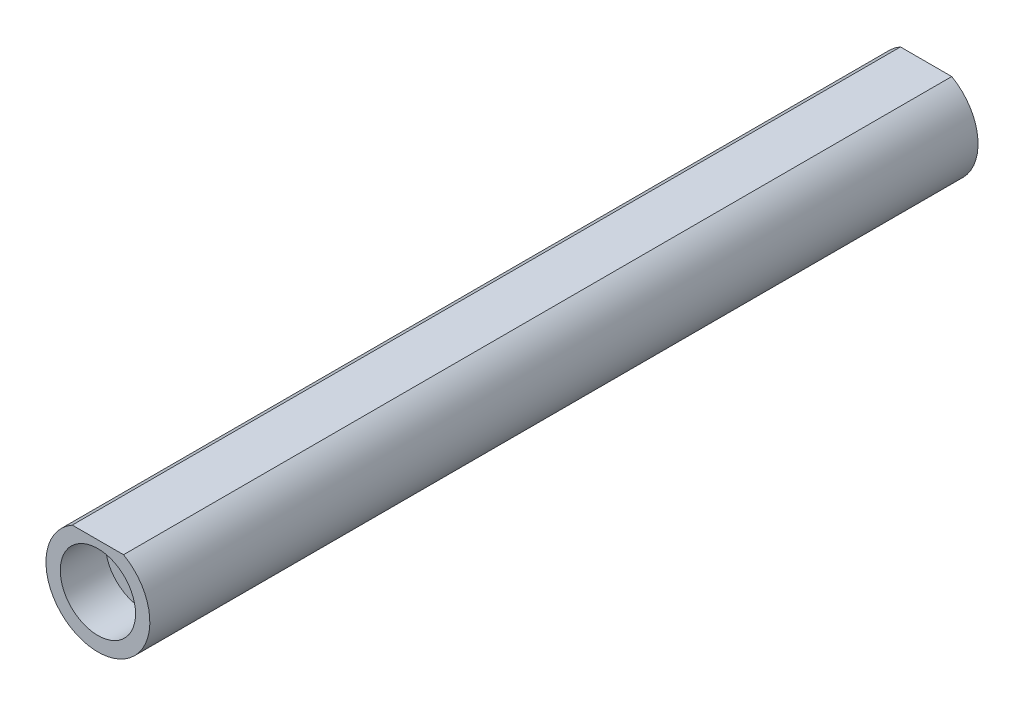
ISO-10303-21;
HEADER;
FILE_DESCRIPTION(('STEP AP214'),'2;1');
FILE_NAME('part.step','',(''),(''),'','','');
FILE_SCHEMA(('AUTOMOTIVE_DESIGN { 1 0 10303 214 1 1 1 1 }'));
ENDSEC;
DATA;
#1=APPLICATION_CONTEXT('core data for automotive mechanical design processes');
#2=APPLICATION_PROTOCOL_DEFINITION('international standard','automotive_design',2000,#1);
#3=PRODUCT_CONTEXT('',#1,'mechanical');
#4=PRODUCT('Part','Part','',(#3));
#5=PRODUCT_RELATED_PRODUCT_CATEGORY('part','',(#4));
#6=PRODUCT_DEFINITION_FORMATION('','',#4);
#7=PRODUCT_DEFINITION_CONTEXT('part definition',#1,'design');
#8=PRODUCT_DEFINITION('design','',#6,#7);
#9=PRODUCT_DEFINITION_SHAPE('','',#8);
#10=(LENGTH_UNIT() NAMED_UNIT(*) SI_UNIT(.MILLI.,.METRE.));
#11=(NAMED_UNIT(*) PLANE_ANGLE_UNIT() SI_UNIT($,.RADIAN.));
#12=(NAMED_UNIT(*) SI_UNIT($,.STERADIAN.) SOLID_ANGLE_UNIT());
#13=UNCERTAINTY_MEASURE_WITH_UNIT(LENGTH_MEASURE(1.E-05),#10,'distance_accuracy_value','');
#14=(GEOMETRIC_REPRESENTATION_CONTEXT(3) GLOBAL_UNCERTAINTY_ASSIGNED_CONTEXT((#13)) GLOBAL_UNIT_ASSIGNED_CONTEXT((#10,
#11,#12)) REPRESENTATION_CONTEXT('',''));
#15=CARTESIAN_POINT('',(0.,0.,0.));
#16=DIRECTION('',(0.,0.,1.));
#17=DIRECTION('',(1.,0.,0.));
#18=AXIS2_PLACEMENT_3D('',#15,#16,#17);
#19=CARTESIAN_POINT('',(0.,0.,55.));
#20=DIRECTION('',(0.,0.,-1.));
#21=DIRECTION('',(-1.,0.,0.));
#22=AXIS2_PLACEMENT_3D('',#19,#20,#21);
#23=CYLINDRICAL_SURFACE('',#22,3.45);
#24=CARTESIAN_POINT('',(0.,0.,0.));
#25=DIRECTION('',(0.,0.,1.));
#26=DIRECTION('',(1.,0.,0.));
#27=AXIS2_PLACEMENT_3D('',#24,#25,#26);
#28=CIRCLE('',#27,3.45);
#29=CARTESIAN_POINT('',(-1.70367250374008,3.,0.));
#30=VERTEX_POINT('',#29);
#31=CARTESIAN_POINT('',(1.70367250374008,3.,0.));
#32=VERTEX_POINT('',#31);
#33=EDGE_CURVE('E78',#30,#32,#28,.T.);
#34=ORIENTED_EDGE('',*,*,#33,.T.);
#35=DIRECTION('',(0.,0.,-1.));
#36=VECTOR('',#35,1.);
#37=CARTESIAN_POINT('',(1.70367250374008,3.,55.));
#38=LINE('',#37,#36);
#39=CARTESIAN_POINT('',(1.70367250374008,3.,55.));
#40=VERTEX_POINT('',#39);
#41=EDGE_CURVE('E11',#40,#32,#38,.T.);
#42=ORIENTED_EDGE('',*,*,#41,.F.);
#43=CARTESIAN_POINT('',(0.,0.,55.));
#44=DIRECTION('',(0.,0.,1.));
#45=DIRECTION('',(1.,0.,0.));
#46=AXIS2_PLACEMENT_3D('',#43,#44,#45);
#47=CIRCLE('',#46,3.45);
#48=CARTESIAN_POINT('',(-1.70367250374008,3.,55.));
#49=VERTEX_POINT('',#48);
#50=EDGE_CURVE('E77',#49,#40,#47,.T.);
#51=ORIENTED_EDGE('',*,*,#50,.F.);
#52=DIRECTION('',(0.,0.,-1.));
#53=VECTOR('',#52,1.);
#54=CARTESIAN_POINT('',(-1.70367250374008,3.,55.));
#55=LINE('',#54,#53);
#56=EDGE_CURVE('E54',#49,#30,#55,.T.);
#57=ORIENTED_EDGE('',*,*,#56,.T.);
#58=EDGE_LOOP('',(#34,#42,#51,#57));
#59=FACE_BOUND('',#58,.T.);
#60=ADVANCED_FACE('F45',(#59),#23,.T.);
#61=CARTESIAN_POINT('',(-1.70367250374008,3.,55.));
#62=DIRECTION('',(0.,-1.,0.));
#63=DIRECTION('',(0.,0.,-1.));
#64=AXIS2_PLACEMENT_3D('',#61,#62,#63);
#65=PLANE('',#64);
#66=DIRECTION('',(-1.,0.,0.));
#67=VECTOR('',#66,1.);
#68=CARTESIAN_POINT('',(-1.70367250374008,3.,0.));
#69=LINE('',#68,#67);
#70=EDGE_CURVE('E69',#32,#30,#69,.T.);
#71=ORIENTED_EDGE('',*,*,#70,.T.);
#72=ORIENTED_EDGE('',*,*,#56,.F.);
#73=DIRECTION('',(-1.,0.,0.));
#74=VECTOR('',#73,1.);
#75=CARTESIAN_POINT('',(-1.70367250374008,3.,55.));
#76=LINE('',#75,#74);
#77=EDGE_CURVE('E61',#40,#49,#76,.T.);
#78=ORIENTED_EDGE('',*,*,#77,.F.);
#79=ORIENTED_EDGE('',*,*,#41,.T.);
#80=EDGE_LOOP('',(#71,#72,#78,#79));
#81=FACE_BOUND('',#80,.T.);
#82=ADVANCED_FACE('F72',(#81),#65,.F.);
#83=CARTESIAN_POINT('',(0.,0.,55.));
#84=DIRECTION('',(0.,0.,1.));
#85=DIRECTION('',(1.,0.,0.));
#86=AXIS2_PLACEMENT_3D('',#83,#84,#85);
#87=PLANE('',#86);
#88=CARTESIAN_POINT('',(0.,0.,55.));
#89=DIRECTION('',(0.,0.,1.));
#90=DIRECTION('',(1.,0.,0.));
#91=AXIS2_PLACEMENT_3D('',#88,#89,#90);
#92=CIRCLE('',#91,2.5);
#93=CARTESIAN_POINT('',(2.5,0.,55.));
#94=VERTEX_POINT('',#93);
#95=EDGE_CURVE('E88',#94,#94,#92,.T.);
#96=ORIENTED_EDGE('',*,*,#95,.F.);
#97=EDGE_LOOP('',(#96));
#98=FACE_BOUND('',#97,.T.);
#99=ORIENTED_EDGE('',*,*,#50,.T.);
#100=ORIENTED_EDGE('',*,*,#77,.T.);
#101=EDGE_LOOP('',(#99,#100));
#102=FACE_BOUND('',#101,.T.);
#103=ADVANCED_FACE('F101',(#98,#102),#87,.T.);
#104=CARTESIAN_POINT('',(0.,0.,0.));
#105=DIRECTION('',(0.,0.,1.));
#106=DIRECTION('',(1.,0.,0.));
#107=AXIS2_PLACEMENT_3D('',#104,#105,#106);
#108=PLANE('',#107);
#109=ORIENTED_EDGE('',*,*,#33,.F.);
#110=ORIENTED_EDGE('',*,*,#70,.F.);
#111=EDGE_LOOP('',(#109,#110));
#112=FACE_BOUND('',#111,.T.);
#113=ADVANCED_FACE('F82',(#112),#108,.F.);
#114=CARTESIAN_POINT('',(0.,0.,52.));
#115=DIRECTION('',(0.,0.,1.));
#116=DIRECTION('',(1.,0.,0.));
#117=AXIS2_PLACEMENT_3D('',#114,#115,#116);
#118=CYLINDRICAL_SURFACE('',#117,2.5);
#119=CARTESIAN_POINT('',(0.,0.,52.));
#120=DIRECTION('',(0.,0.,1.));
#121=DIRECTION('',(1.,0.,0.));
#122=AXIS2_PLACEMENT_3D('',#119,#120,#121);
#123=CIRCLE('',#122,2.5);
#124=CARTESIAN_POINT('',(2.5,0.,52.));
#125=VERTEX_POINT('',#124);
#126=EDGE_CURVE('E84',#125,#125,#123,.T.);
#127=ORIENTED_EDGE('',*,*,#126,.F.);
#128=EDGE_LOOP('',(#127));
#129=FACE_BOUND('',#128,.T.);
#130=ORIENTED_EDGE('',*,*,#95,.T.);
#131=EDGE_LOOP('',(#130));
#132=FACE_BOUND('',#131,.T.);
#133=ADVANCED_FACE('F99',(#129,#132),#118,.F.);
#134=CARTESIAN_POINT('',(0.,0.,52.));
#135=DIRECTION('',(0.,0.,1.));
#136=DIRECTION('',(1.,0.,0.));
#137=AXIS2_PLACEMENT_3D('',#134,#135,#136);
#138=PLANE('',#137);
#139=ORIENTED_EDGE('',*,*,#126,.T.);
#140=EDGE_LOOP('',(#139));
#141=FACE_BOUND('',#140,.T.);
#142=ADVANCED_FACE('F136',(#141),#138,.T.);
#143=CLOSED_SHELL('',(#60,#82,#103,#113,#133,#142));
#144=MANIFOLD_SOLID_BREP('B2',#143);
#145=ADVANCED_BREP_SHAPE_REPRESENTATION('',(#18,#144),#14);
#146=SHAPE_DEFINITION_REPRESENTATION(#9,#145);
ENDSEC;
END-ISO-10303-21;
